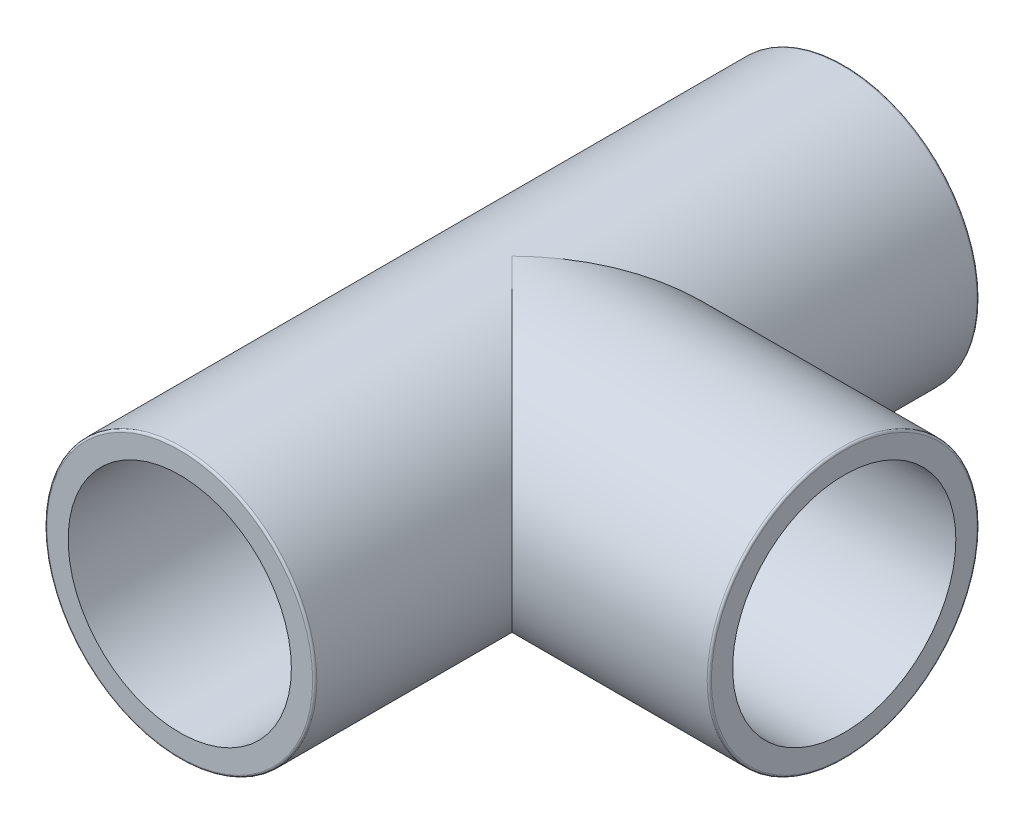
ISO-10303-21;
HEADER;
FILE_DESCRIPTION(('STEP AP214'),'2;1');
FILE_NAME('part.step','',(''),(''),'','','');
FILE_SCHEMA(('AUTOMOTIVE_DESIGN { 1 0 10303 214 1 1 1 1 }'));
ENDSEC;
DATA;
#1=APPLICATION_CONTEXT('core data for automotive mechanical design processes');
#2=APPLICATION_PROTOCOL_DEFINITION('international standard','automotive_design',2000,#1);
#3=PRODUCT_CONTEXT('',#1,'mechanical');
#4=PRODUCT('Part','Part','',(#3));
#5=PRODUCT_RELATED_PRODUCT_CATEGORY('part','',(#4));
#6=PRODUCT_DEFINITION_FORMATION('','',#4);
#7=PRODUCT_DEFINITION_CONTEXT('part definition',#1,'design');
#8=PRODUCT_DEFINITION('design','',#6,#7);
#9=PRODUCT_DEFINITION_SHAPE('','',#8);
#10=(LENGTH_UNIT() NAMED_UNIT(*) SI_UNIT(.MILLI.,.METRE.));
#11=(NAMED_UNIT(*) PLANE_ANGLE_UNIT() SI_UNIT($,.RADIAN.));
#12=(NAMED_UNIT(*) SI_UNIT($,.STERADIAN.) SOLID_ANGLE_UNIT());
#13=UNCERTAINTY_MEASURE_WITH_UNIT(LENGTH_MEASURE(1.E-05),#10,'distance_accuracy_value','');
#14=(GEOMETRIC_REPRESENTATION_CONTEXT(3) GLOBAL_UNCERTAINTY_ASSIGNED_CONTEXT((#13)) GLOBAL_UNIT_ASSIGNED_CONTEXT((#10,
#11,#12)) REPRESENTATION_CONTEXT('',''));
#15=CARTESIAN_POINT('',(0.,0.,0.));
#16=DIRECTION('',(0.,0.,1.));
#17=DIRECTION('',(1.,0.,0.));
#18=AXIS2_PLACEMENT_3D('',#15,#16,#17);
#19=CARTESIAN_POINT('',(0.,0.,-32.));
#20=DIRECTION('',(1.,0.,0.));
#21=DIRECTION('',(0.,0.,-1.));
#22=AXIS2_PLACEMENT_3D('',#19,#20,#21);
#23=CYLINDRICAL_SURFACE('',#22,10.25);
#24=CARTESIAN_POINT('',(0.,0.,-32.));
#25=DIRECTION('',(0.707106781186547,0.,-0.707106781186547));
#26=DIRECTION('',(0.707106781186547,0.,0.707106781186547));
#27=AXIS2_PLACEMENT_3D('',#24,#25,#26);
#28=ELLIPSE('',#27,14.4956890143242,10.25);
#29=CARTESIAN_POINT('',(0.,-10.25,-32.));
#30=VERTEX_POINT('',#29);
#31=CARTESIAN_POINT('',(0.,10.25,-32.));
#32=VERTEX_POINT('',#31);
#33=EDGE_CURVE('E59',#30,#32,#28,.F.);
#34=ORIENTED_EDGE('',*,*,#33,.T.);
#35=CARTESIAN_POINT('',(0.,0.,-32.));
#36=DIRECTION('',(0.707106781186547,0.,0.707106781186547));
#37=DIRECTION('',(0.707106781186547,0.,-0.707106781186547));
#38=AXIS2_PLACEMENT_3D('',#35,#36,#37);
#39=ELLIPSE('',#38,14.4956890143242,10.25);
#40=EDGE_CURVE('E47',#32,#30,#39,.F.);
#41=ORIENTED_EDGE('',*,*,#40,.T.);
#42=EDGE_LOOP('',(#34,#41));
#43=FACE_BOUND('',#42,.T.);
#44=CARTESIAN_POINT('',(12.,0.,-32.));
#45=DIRECTION('',(1.,0.,0.));
#46=DIRECTION('',(0.,0.,-1.));
#47=AXIS2_PLACEMENT_3D('',#44,#45,#46);
#48=CIRCLE('',#47,10.25);
#49=CARTESIAN_POINT('',(12.,0.,-42.25));
#50=VERTEX_POINT('',#49);
#51=EDGE_CURVE('E82',#50,#50,#48,.F.);
#52=ORIENTED_EDGE('',*,*,#51,.F.);
#53=EDGE_LOOP('',(#52));
#54=FACE_BOUND('',#53,.T.);
#55=ADVANCED_FACE('F33',(#43,#54),#23,.F.);
#56=CARTESIAN_POINT('',(0.,0.,-64.));
#57=DIRECTION('',(0.,0.,1.));
#58=DIRECTION('',(1.,0.,0.));
#59=AXIS2_PLACEMENT_3D('',#56,#57,#58);
#60=CYLINDRICAL_SURFACE('',#59,10.25);
#61=CARTESIAN_POINT('',(0.,0.,-20.));
#62=DIRECTION('',(0.,0.,1.));
#63=DIRECTION('',(1.,0.,0.));
#64=AXIS2_PLACEMENT_3D('',#61,#62,#63);
#65=CIRCLE('',#64,10.25);
#66=CARTESIAN_POINT('',(10.25,0.,-20.));
#67=VERTEX_POINT('',#66);
#68=EDGE_CURVE('E73',#67,#67,#65,.F.);
#69=ORIENTED_EDGE('',*,*,#68,.F.);
#70=EDGE_LOOP('',(#69));
#71=FACE_BOUND('',#70,.T.);
#72=ORIENTED_EDGE('',*,*,#40,.F.);
#73=ORIENTED_EDGE('',*,*,#33,.F.);
#74=EDGE_LOOP('',(#72,#73));
#75=FACE_BOUND('',#74,.T.);
#76=CARTESIAN_POINT('',(0.,0.,-44.));
#77=DIRECTION('',(0.,0.,-1.));
#78=DIRECTION('',(-1.,0.,0.));
#79=AXIS2_PLACEMENT_3D('',#76,#77,#78);
#80=CIRCLE('',#79,10.25);
#81=CARTESIAN_POINT('',(-10.25,0.,-44.));
#82=VERTEX_POINT('',#81);
#83=EDGE_CURVE('E77',#82,#82,#80,.F.);
#84=ORIENTED_EDGE('',*,*,#83,.F.);
#85=EDGE_LOOP('',(#84));
#86=FACE_BOUND('',#85,.T.);
#87=ADVANCED_FACE('F60',(#71,#75,#86),#60,.F.);
#88=CARTESIAN_POINT('',(0.,0.,-64.));
#89=DIRECTION('',(0.,0.,1.));
#90=DIRECTION('',(1.,0.,0.));
#91=AXIS2_PLACEMENT_3D('',#88,#89,#90);
#92=CYLINDRICAL_SURFACE('',#91,13.);
#93=CARTESIAN_POINT('',(0.,0.,-63.8));
#94=DIRECTION('',(0.,0.,1.));
#95=DIRECTION('',(1.,0.,0.));
#96=AXIS2_PLACEMENT_3D('',#93,#94,#95);
#97=CIRCLE('',#96,13.);
#98=CARTESIAN_POINT('',(13.,0.,-63.8));
#99=VERTEX_POINT('',#98);
#100=EDGE_CURVE('E69',#99,#99,#97,.T.);
#101=ORIENTED_EDGE('',*,*,#100,.T.);
#102=EDGE_LOOP('',(#101));
#103=FACE_BOUND('',#102,.T.);
#104=CARTESIAN_POINT('',(0.,0.,-0.200000000000006));
#105=DIRECTION('',(0.,0.,1.));
#106=DIRECTION('',(1.,0.,0.));
#107=AXIS2_PLACEMENT_3D('',#104,#105,#106);
#108=CIRCLE('',#107,13.);
#109=CARTESIAN_POINT('',(13.,0.,-0.200000000000006));
#110=VERTEX_POINT('',#109);
#111=EDGE_CURVE('E66',#110,#110,#108,.F.);
#112=ORIENTED_EDGE('',*,*,#111,.T.);
#113=EDGE_LOOP('',(#112));
#114=FACE_BOUND('',#113,.T.);
#115=CARTESIAN_POINT('',(0.,0.,-32.));
#116=DIRECTION('',(0.707106781186547,0.,0.707106781186547));
#117=DIRECTION('',(-0.707106781186547,0.,0.707106781186547));
#118=AXIS2_PLACEMENT_3D('',#115,#116,#117);
#119=ELLIPSE('',#118,18.3847763108502,13.);
#120=CARTESIAN_POINT('',(0.,-13.,-32.));
#121=VERTEX_POINT('',#120);
#122=CARTESIAN_POINT('',(0.,13.,-32.));
#123=VERTEX_POINT('',#122);
#124=EDGE_CURVE('E63',#121,#123,#119,.T.);
#125=ORIENTED_EDGE('',*,*,#124,.F.);
#126=CARTESIAN_POINT('',(0.,0.,-32.));
#127=DIRECTION('',(-0.707106781186547,0.,0.707106781186547));
#128=DIRECTION('',(0.707106781186547,0.,0.707106781186547));
#129=AXIS2_PLACEMENT_3D('',#126,#127,#128);
#130=ELLIPSE('',#129,18.3847763108502,13.);
#131=EDGE_CURVE('E54',#123,#121,#130,.F.);
#132=ORIENTED_EDGE('',*,*,#131,.F.);
#133=EDGE_LOOP('',(#125,#132));
#134=FACE_BOUND('',#133,.T.);
#135=ADVANCED_FACE('F114',(#103,#114,#134),#92,.T.);
#136=CARTESIAN_POINT('',(0.,0.,-64.));
#137=DIRECTION('',(0.,0.,1.));
#138=DIRECTION('',(1.,0.,0.));
#139=AXIS2_PLACEMENT_3D('',#136,#137,#138);
#140=PLANE('',#139);
#141=CARTESIAN_POINT('',(0.,0.,-64.));
#142=DIRECTION('',(0.,0.,1.));
#143=DIRECTION('',(1.,0.,0.));
#144=AXIS2_PLACEMENT_3D('',#141,#142,#143);
#145=CIRCLE('',#144,12.8);
#146=CARTESIAN_POINT('',(12.8,0.,-64.));
#147=VERTEX_POINT('',#146);
#148=EDGE_CURVE('E89',#147,#147,#145,.F.);
#149=ORIENTED_EDGE('',*,*,#148,.T.);
#150=EDGE_LOOP('',(#149));
#151=FACE_BOUND('',#150,.T.);
#152=CARTESIAN_POINT('',(0.,0.,-64.));
#153=DIRECTION('',(0.,0.,-1.));
#154=DIRECTION('',(-1.,0.,0.));
#155=AXIS2_PLACEMENT_3D('',#152,#153,#154);
#156=CIRCLE('',#155,10.75);
#157=CARTESIAN_POINT('',(-10.75,0.,-64.));
#158=VERTEX_POINT('',#157);
#159=EDGE_CURVE('E84',#158,#158,#156,.T.);
#160=ORIENTED_EDGE('',*,*,#159,.F.);
#161=EDGE_LOOP('',(#160));
#162=FACE_BOUND('',#161,.T.);
#163=ADVANCED_FACE('F129',(#151,#162),#140,.F.);
#164=CARTESIAN_POINT('',(0.,0.,0.));
#165=DIRECTION('',(0.,0.,1.));
#166=DIRECTION('',(1.,0.,0.));
#167=AXIS2_PLACEMENT_3D('',#164,#165,#166);
#168=PLANE('',#167);
#169=CARTESIAN_POINT('',(0.,0.,0.));
#170=DIRECTION('',(0.,0.,1.));
#171=DIRECTION('',(1.,0.,0.));
#172=AXIS2_PLACEMENT_3D('',#169,#170,#171);
#173=CIRCLE('',#172,12.8);
#174=CARTESIAN_POINT('',(12.8,0.,0.));
#175=VERTEX_POINT('',#174);
#176=EDGE_CURVE('E92',#175,#175,#173,.T.);
#177=ORIENTED_EDGE('',*,*,#176,.T.);
#178=EDGE_LOOP('',(#177));
#179=FACE_BOUND('',#178,.T.);
#180=CARTESIAN_POINT('',(0.,0.,0.));
#181=DIRECTION('',(0.,0.,1.));
#182=DIRECTION('',(1.,0.,0.));
#183=AXIS2_PLACEMENT_3D('',#180,#181,#182);
#184=CIRCLE('',#183,10.75);
#185=CARTESIAN_POINT('',(10.75,0.,0.));
#186=VERTEX_POINT('',#185);
#187=EDGE_CURVE('E80',#186,#186,#184,.T.);
#188=ORIENTED_EDGE('',*,*,#187,.F.);
#189=EDGE_LOOP('',(#188));
#190=FACE_BOUND('',#189,.T.);
#191=ADVANCED_FACE('F126',(#179,#190),#168,.T.);
#192=CARTESIAN_POINT('',(0.,0.,-32.));
#193=DIRECTION('',(1.,0.,0.));
#194=DIRECTION('',(0.,0.,-1.));
#195=AXIS2_PLACEMENT_3D('',#192,#193,#194);
#196=CYLINDRICAL_SURFACE('',#195,13.);
#197=CARTESIAN_POINT('',(31.8,0.,-32.));
#198=DIRECTION('',(1.,0.,0.));
#199=DIRECTION('',(0.,0.,-1.));
#200=AXIS2_PLACEMENT_3D('',#197,#198,#199);
#201=CIRCLE('',#200,13.);
#202=CARTESIAN_POINT('',(31.8,0.,-45.));
#203=VERTEX_POINT('',#202);
#204=EDGE_CURVE('E11',#203,#203,#201,.F.);
#205=ORIENTED_EDGE('',*,*,#204,.T.);
#206=EDGE_LOOP('',(#205));
#207=FACE_BOUND('',#206,.T.);
#208=ORIENTED_EDGE('',*,*,#131,.T.);
#209=ORIENTED_EDGE('',*,*,#124,.T.);
#210=EDGE_LOOP('',(#208,#209));
#211=FACE_BOUND('',#210,.T.);
#212=ADVANCED_FACE('F124',(#207,#211),#196,.T.);
#213=CARTESIAN_POINT('',(32.,0.,-32.));
#214=DIRECTION('',(1.,0.,0.));
#215=DIRECTION('',(0.,0.,-1.));
#216=AXIS2_PLACEMENT_3D('',#213,#214,#215);
#217=PLANE('',#216);
#218=CARTESIAN_POINT('',(32.,0.,-32.));
#219=DIRECTION('',(1.,0.,0.));
#220=DIRECTION('',(0.,0.,-1.));
#221=AXIS2_PLACEMENT_3D('',#218,#219,#220);
#222=CIRCLE('',#221,12.8);
#223=CARTESIAN_POINT('',(32.,0.,-44.8));
#224=VERTEX_POINT('',#223);
#225=EDGE_CURVE('E41',#224,#224,#222,.T.);
#226=ORIENTED_EDGE('',*,*,#225,.T.);
#227=EDGE_LOOP('',(#226));
#228=FACE_BOUND('',#227,.T.);
#229=CARTESIAN_POINT('',(32.,0.,-32.));
#230=DIRECTION('',(1.,0.,0.));
#231=DIRECTION('',(0.,0.,-1.));
#232=AXIS2_PLACEMENT_3D('',#229,#230,#231);
#233=CIRCLE('',#232,10.75);
#234=CARTESIAN_POINT('',(32.,0.,-42.75));
#235=VERTEX_POINT('',#234);
#236=EDGE_CURVE('E164',#235,#235,#233,.T.);
#237=ORIENTED_EDGE('',*,*,#236,.F.);
#238=EDGE_LOOP('',(#237));
#239=FACE_BOUND('',#238,.T.);
#240=ADVANCED_FACE('F97',(#228,#239),#217,.T.);
#241=CARTESIAN_POINT('',(0.,0.,-20.));
#242=DIRECTION('',(0.,0.,1.));
#243=DIRECTION('',(1.,0.,0.));
#244=AXIS2_PLACEMENT_3D('',#241,#242,#243);
#245=PLANE('',#244);
#246=CARTESIAN_POINT('',(0.,0.,-20.));
#247=DIRECTION('',(0.,0.,1.));
#248=DIRECTION('',(1.,0.,0.));
#249=AXIS2_PLACEMENT_3D('',#246,#247,#248);
#250=CIRCLE('',#249,10.75);
#251=CARTESIAN_POINT('',(10.75,0.,-20.));
#252=VERTEX_POINT('',#251);
#253=EDGE_CURVE('E76',#252,#252,#250,.T.);
#254=ORIENTED_EDGE('',*,*,#253,.T.);
#255=EDGE_LOOP('',(#254));
#256=FACE_BOUND('',#255,.T.);
#257=ORIENTED_EDGE('',*,*,#68,.T.);
#258=EDGE_LOOP('',(#257));
#259=FACE_BOUND('',#258,.T.);
#260=ADVANCED_FACE('F123',(#256,#259),#245,.T.);
#261=CARTESIAN_POINT('',(0.,0.,-20.));
#262=DIRECTION('',(0.,0.,1.));
#263=DIRECTION('',(1.,0.,0.));
#264=AXIS2_PLACEMENT_3D('',#261,#262,#263);
#265=CYLINDRICAL_SURFACE('',#264,10.75);
#266=ORIENTED_EDGE('',*,*,#253,.F.);
#267=EDGE_LOOP('',(#266));
#268=FACE_BOUND('',#267,.T.);
#269=ORIENTED_EDGE('',*,*,#187,.T.);
#270=EDGE_LOOP('',(#269));
#271=FACE_BOUND('',#270,.T.);
#272=ADVANCED_FACE('F119',(#268,#271),#265,.F.);
#273=CARTESIAN_POINT('',(0.,0.,-44.));
#274=DIRECTION('',(0.,0.,-1.));
#275=DIRECTION('',(-1.,0.,0.));
#276=AXIS2_PLACEMENT_3D('',#273,#274,#275);
#277=PLANE('',#276);
#278=CARTESIAN_POINT('',(0.,0.,-44.));
#279=DIRECTION('',(0.,0.,-1.));
#280=DIRECTION('',(-1.,0.,0.));
#281=AXIS2_PLACEMENT_3D('',#278,#279,#280);
#282=CIRCLE('',#281,10.75);
#283=CARTESIAN_POINT('',(-10.75,0.,-44.));
#284=VERTEX_POINT('',#283);
#285=EDGE_CURVE('E81',#284,#284,#282,.T.);
#286=ORIENTED_EDGE('',*,*,#285,.T.);
#287=EDGE_LOOP('',(#286));
#288=FACE_BOUND('',#287,.T.);
#289=ORIENTED_EDGE('',*,*,#83,.T.);
#290=EDGE_LOOP('',(#289));
#291=FACE_BOUND('',#290,.T.);
#292=ADVANCED_FACE('F180',(#288,#291),#277,.T.);
#293=CARTESIAN_POINT('',(0.,0.,-44.));
#294=DIRECTION('',(0.,0.,-1.));
#295=DIRECTION('',(-1.,0.,0.));
#296=AXIS2_PLACEMENT_3D('',#293,#294,#295);
#297=CYLINDRICAL_SURFACE('',#296,10.75);
#298=ORIENTED_EDGE('',*,*,#285,.F.);
#299=EDGE_LOOP('',(#298));
#300=FACE_BOUND('',#299,.T.);
#301=ORIENTED_EDGE('',*,*,#159,.T.);
#302=EDGE_LOOP('',(#301));
#303=FACE_BOUND('',#302,.T.);
#304=ADVANCED_FACE('F174',(#300,#303),#297,.F.);
#305=CARTESIAN_POINT('',(12.,0.,-32.));
#306=DIRECTION('',(1.,0.,0.));
#307=DIRECTION('',(0.,0.,-1.));
#308=AXIS2_PLACEMENT_3D('',#305,#306,#307);
#309=PLANE('',#308);
#310=CARTESIAN_POINT('',(12.,0.,-32.));
#311=DIRECTION('',(1.,0.,0.));
#312=DIRECTION('',(0.,0.,-1.));
#313=AXIS2_PLACEMENT_3D('',#310,#311,#312);
#314=CIRCLE('',#313,10.75);
#315=CARTESIAN_POINT('',(12.,0.,-42.75));
#316=VERTEX_POINT('',#315);
#317=EDGE_CURVE('E85',#316,#316,#314,.T.);
#318=ORIENTED_EDGE('',*,*,#317,.T.);
#319=EDGE_LOOP('',(#318));
#320=FACE_BOUND('',#319,.T.);
#321=ORIENTED_EDGE('',*,*,#51,.T.);
#322=EDGE_LOOP('',(#321));
#323=FACE_BOUND('',#322,.T.);
#324=ADVANCED_FACE('F145',(#320,#323),#309,.T.);
#325=CARTESIAN_POINT('',(12.,0.,-32.));
#326=DIRECTION('',(1.,0.,0.));
#327=DIRECTION('',(0.,0.,-1.));
#328=AXIS2_PLACEMENT_3D('',#325,#326,#327);
#329=CYLINDRICAL_SURFACE('',#328,10.75);
#330=ORIENTED_EDGE('',*,*,#317,.F.);
#331=EDGE_LOOP('',(#330));
#332=FACE_BOUND('',#331,.T.);
#333=ORIENTED_EDGE('',*,*,#236,.T.);
#334=EDGE_LOOP('',(#333));
#335=FACE_BOUND('',#334,.T.);
#336=ADVANCED_FACE('F140',(#332,#335),#329,.F.);
#337=CARTESIAN_POINT('',(0.,0.,-63.8));
#338=DIRECTION('',(0.,0.,1.));
#339=DIRECTION('',(1.,0.,0.));
#340=AXIS2_PLACEMENT_3D('',#337,#338,#339);
#341=TOROIDAL_SURFACE('',#340,12.8,0.2);
#342=ORIENTED_EDGE('',*,*,#148,.F.);
#343=EDGE_LOOP('',(#342));
#344=FACE_BOUND('',#343,.T.);
#345=ORIENTED_EDGE('',*,*,#100,.F.);
#346=EDGE_LOOP('',(#345));
#347=FACE_BOUND('',#346,.T.);
#348=ADVANCED_FACE('F106',(#344,#347),#341,.T.);
#349=CARTESIAN_POINT('',(0.,0.,-0.200000000000006));
#350=DIRECTION('',(0.,0.,1.));
#351=DIRECTION('',(1.,0.,0.));
#352=AXIS2_PLACEMENT_3D('',#349,#350,#351);
#353=TOROIDAL_SURFACE('',#352,12.8,0.2);
#354=ORIENTED_EDGE('',*,*,#111,.F.);
#355=EDGE_LOOP('',(#354));
#356=FACE_BOUND('',#355,.T.);
#357=ORIENTED_EDGE('',*,*,#176,.F.);
#358=EDGE_LOOP('',(#357));
#359=FACE_BOUND('',#358,.T.);
#360=ADVANCED_FACE('F101',(#356,#359),#353,.T.);
#361=CARTESIAN_POINT('',(31.8,0.,-32.));
#362=DIRECTION('',(1.,0.,0.));
#363=DIRECTION('',(0.,0.,-1.));
#364=AXIS2_PLACEMENT_3D('',#361,#362,#363);
#365=TOROIDAL_SURFACE('',#364,12.8,0.2);
#366=ORIENTED_EDGE('',*,*,#204,.F.);
#367=EDGE_LOOP('',(#366));
#368=FACE_BOUND('',#367,.T.);
#369=ORIENTED_EDGE('',*,*,#225,.F.);
#370=EDGE_LOOP('',(#369));
#371=FACE_BOUND('',#370,.T.);
#372=ADVANCED_FACE('F35',(#368,#371),#365,.T.);
#373=CLOSED_SHELL('',(#55,#87,#135,#163,#191,#212,#240,#260,#272,#292,#304,#324,#336,#348,#360,#372));
#374=MANIFOLD_SOLID_BREP('B2',#373);
#375=ADVANCED_BREP_SHAPE_REPRESENTATION('',(#18,#374),#14);
#376=SHAPE_DEFINITION_REPRESENTATION(#9,#375);
ENDSEC;
END-ISO-10303-21;
